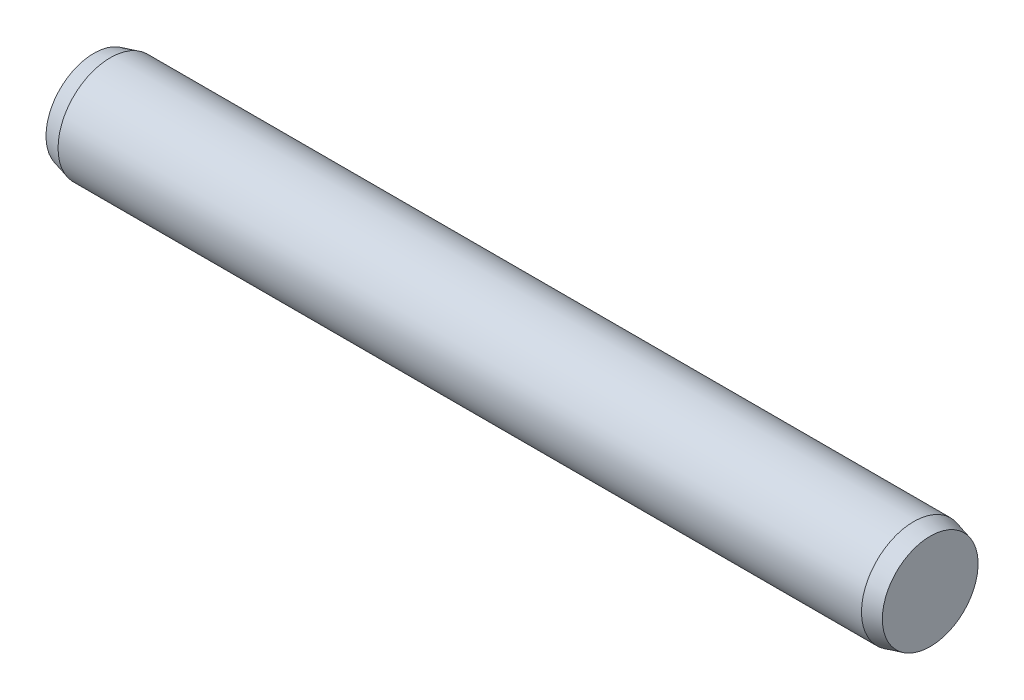
ISO-10303-21;
HEADER;
FILE_DESCRIPTION(('STEP AP214'),'2;1');
FILE_NAME('part.step','',(''),(''),'','','');
FILE_SCHEMA(('AUTOMOTIVE_DESIGN { 1 0 10303 214 1 1 1 1 }'));
ENDSEC;
DATA;
#1=APPLICATION_CONTEXT('core data for automotive mechanical design processes');
#2=APPLICATION_PROTOCOL_DEFINITION('international standard','automotive_design',2000,#1);
#3=PRODUCT_CONTEXT('',#1,'mechanical');
#4=PRODUCT('Part','Part','',(#3));
#5=PRODUCT_RELATED_PRODUCT_CATEGORY('part','',(#4));
#6=PRODUCT_DEFINITION_FORMATION('','',#4);
#7=PRODUCT_DEFINITION_CONTEXT('part definition',#1,'design');
#8=PRODUCT_DEFINITION('design','',#6,#7);
#9=PRODUCT_DEFINITION_SHAPE('','',#8);
#10=(LENGTH_UNIT() NAMED_UNIT(*) SI_UNIT(.MILLI.,.METRE.));
#11=(NAMED_UNIT(*) PLANE_ANGLE_UNIT() SI_UNIT($,.RADIAN.));
#12=(NAMED_UNIT(*) SI_UNIT($,.STERADIAN.) SOLID_ANGLE_UNIT());
#13=UNCERTAINTY_MEASURE_WITH_UNIT(LENGTH_MEASURE(1.E-05),#10,'distance_accuracy_value','');
#14=(GEOMETRIC_REPRESENTATION_CONTEXT(3) GLOBAL_UNCERTAINTY_ASSIGNED_CONTEXT((#13)) GLOBAL_UNIT_ASSIGNED_CONTEXT((#10,
#11,#12)) REPRESENTATION_CONTEXT('',''));
#15=CARTESIAN_POINT('',(0.,0.,0.));
#16=DIRECTION('',(0.,0.,1.));
#17=DIRECTION('',(1.,0.,0.));
#18=AXIS2_PLACEMENT_3D('',#15,#16,#17);
#19=CARTESIAN_POINT('',(0.,1.8311920087684,0.));
#20=DIRECTION('',(1.,0.,0.));
#21=DIRECTION('',(0.,0.,-1.));
#22=AXIS2_PLACEMENT_3D('',#19,#20,#21);
#23=PLANE('',#22);
#24=CARTESIAN_POINT('',(0.,0.,0.));
#25=DIRECTION('',(-1.,0.,0.));
#26=DIRECTION('',(0.,0.,1.));
#27=AXIS2_PLACEMENT_3D('',#24,#25,#26);
#28=CIRCLE('',#27,1.8311920087684);
#29=CARTESIAN_POINT('',(0.,0.,1.8311920087684));
#30=VERTEX_POINT('',#29);
#31=EDGE_CURVE('E46',#30,#30,#28,.T.);
#32=ORIENTED_EDGE('',*,*,#31,.T.);
#33=EDGE_LOOP('',(#32));
#34=FACE_BOUND('',#33,.T.);
#35=ADVANCED_FACE('F32',(#34),#23,.F.);
#36=CARTESIAN_POINT('',(32.,0.,0.));
#37=DIRECTION('',(-1.,0.,0.));
#38=DIRECTION('',(0.,0.,1.));
#39=AXIS2_PLACEMENT_3D('',#36,#37,#38);
#40=PLANE('',#39);
#41=CARTESIAN_POINT('',(32.,0.,0.));
#42=DIRECTION('',(-1.,0.,0.));
#43=DIRECTION('',(0.,0.,1.));
#44=AXIS2_PLACEMENT_3D('',#41,#42,#43);
#45=CIRCLE('',#44,1.8311920087684);
#46=CARTESIAN_POINT('',(32.,0.,1.8311920087684));
#47=VERTEX_POINT('',#46);
#48=EDGE_CURVE('E10',#47,#47,#45,.T.);
#49=ORIENTED_EDGE('',*,*,#48,.F.);
#50=EDGE_LOOP('',(#49));
#51=FACE_BOUND('',#50,.T.);
#52=ADVANCED_FACE('F66',(#51),#40,.F.);
#53=CARTESIAN_POINT('',(32.,0.,0.));
#54=DIRECTION('',(-1.,0.,0.));
#55=DIRECTION('',(0.,0.,1.));
#56=AXIS2_PLACEMENT_3D('',#53,#54,#55);
#57=CONICAL_SURFACE('',#56,1.8311920087684,0.26179938779915);
#58=CARTESIAN_POINT('',(31.37,0.,0.));
#59=DIRECTION('',(-1.,0.,0.));
#60=DIRECTION('',(0.,0.,1.));
#61=AXIS2_PLACEMENT_3D('',#58,#59,#60);
#62=CIRCLE('',#61,2.00000000000001);
#63=CARTESIAN_POINT('',(31.37,0.,2.00000000000001));
#64=VERTEX_POINT('',#63);
#65=EDGE_CURVE('E38',#64,#64,#62,.T.);
#66=ORIENTED_EDGE('',*,*,#65,.F.);
#67=EDGE_LOOP('',(#66));
#68=FACE_BOUND('',#67,.T.);
#69=ORIENTED_EDGE('',*,*,#48,.T.);
#70=EDGE_LOOP('',(#69));
#71=FACE_BOUND('',#70,.T.);
#72=ADVANCED_FACE('F61',(#68,#71),#57,.T.);
#73=CARTESIAN_POINT('',(-6.35,0.,0.));
#74=DIRECTION('',(-1.,0.,0.));
#75=DIRECTION('',(0.,0.,1.));
#76=AXIS2_PLACEMENT_3D('',#73,#74,#75);
#77=CYLINDRICAL_SURFACE('',#76,2.);
#78=CARTESIAN_POINT('',(0.63,0.,0.));
#79=DIRECTION('',(-1.,0.,0.));
#80=DIRECTION('',(0.,0.,1.));
#81=AXIS2_PLACEMENT_3D('',#78,#79,#80);
#82=CIRCLE('',#81,2.);
#83=CARTESIAN_POINT('',(0.63,0.,2.));
#84=VERTEX_POINT('',#83);
#85=EDGE_CURVE('E42',#84,#84,#82,.T.);
#86=ORIENTED_EDGE('',*,*,#85,.F.);
#87=EDGE_LOOP('',(#86));
#88=FACE_BOUND('',#87,.T.);
#89=ORIENTED_EDGE('',*,*,#65,.T.);
#90=EDGE_LOOP('',(#89));
#91=FACE_BOUND('',#90,.T.);
#92=ADVANCED_FACE('F56',(#88,#91),#77,.T.);
#93=CARTESIAN_POINT('',(0.63,0.,0.));
#94=DIRECTION('',(1.,0.,0.));
#95=DIRECTION('',(0.,0.,-1.));
#96=AXIS2_PLACEMENT_3D('',#93,#94,#95);
#97=CONICAL_SURFACE('',#96,2.,0.261799387799143);
#98=ORIENTED_EDGE('',*,*,#31,.F.);
#99=EDGE_LOOP('',(#98));
#100=FACE_BOUND('',#99,.T.);
#101=ORIENTED_EDGE('',*,*,#85,.T.);
#102=EDGE_LOOP('',(#101));
#103=FACE_BOUND('',#102,.T.);
#104=ADVANCED_FACE('F53',(#100,#103),#97,.T.);
#105=CLOSED_SHELL('',(#35,#52,#72,#92,#104));
#106=MANIFOLD_SOLID_BREP('B2',#105);
#107=ADVANCED_BREP_SHAPE_REPRESENTATION('',(#18,#106),#14);
#108=SHAPE_DEFINITION_REPRESENTATION(#9,#107);
ENDSEC;
END-ISO-10303-21;
